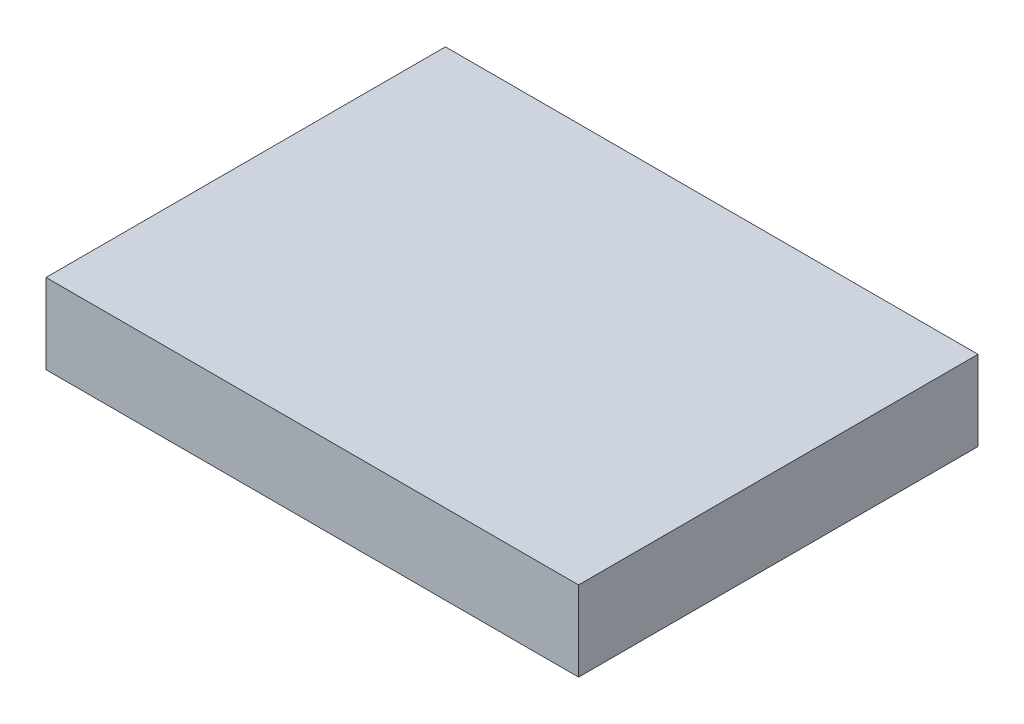
ISO-10303-21;
HEADER;
FILE_DESCRIPTION(('STEP AP214'),'2;1');
FILE_NAME('part.step','',(''),(''),'','','');
FILE_SCHEMA(('AUTOMOTIVE_DESIGN { 1 0 10303 214 1 1 1 1 }'));
ENDSEC;
DATA;
#1=APPLICATION_CONTEXT('core data for automotive mechanical design processes');
#2=APPLICATION_PROTOCOL_DEFINITION('international standard','automotive_design',2000,#1);
#3=PRODUCT_CONTEXT('',#1,'mechanical');
#4=PRODUCT('Part','Part','',(#3));
#5=PRODUCT_RELATED_PRODUCT_CATEGORY('part','',(#4));
#6=PRODUCT_DEFINITION_FORMATION('','',#4);
#7=PRODUCT_DEFINITION_CONTEXT('part definition',#1,'design');
#8=PRODUCT_DEFINITION('design','',#6,#7);
#9=PRODUCT_DEFINITION_SHAPE('','',#8);
#10=(LENGTH_UNIT() NAMED_UNIT(*) SI_UNIT(.MILLI.,.METRE.));
#11=(NAMED_UNIT(*) PLANE_ANGLE_UNIT() SI_UNIT($,.RADIAN.));
#12=(NAMED_UNIT(*) SI_UNIT($,.STERADIAN.) SOLID_ANGLE_UNIT());
#13=UNCERTAINTY_MEASURE_WITH_UNIT(LENGTH_MEASURE(1.E-05),#10,'distance_accuracy_value','');
#14=(GEOMETRIC_REPRESENTATION_CONTEXT(3) GLOBAL_UNCERTAINTY_ASSIGNED_CONTEXT((#13)) GLOBAL_UNIT_ASSIGNED_CONTEXT((#10,
#11,#12)) REPRESENTATION_CONTEXT('',''));
#15=CARTESIAN_POINT('',(0.,0.,0.));
#16=DIRECTION('',(0.,0.,1.));
#17=DIRECTION('',(1.,0.,0.));
#18=AXIS2_PLACEMENT_3D('',#15,#16,#17);
#19=CARTESIAN_POINT('',(-10.,3.,-7.5));
#20=DIRECTION('',(1.,0.,0.));
#21=DIRECTION('',(0.,0.,-1.));
#22=AXIS2_PLACEMENT_3D('',#19,#20,#21);
#23=PLANE('',#22);
#24=DIRECTION('',(0.,0.,1.));
#25=VECTOR('',#24,1.);
#26=CARTESIAN_POINT('',(-10.,0.,-7.5));
#27=LINE('',#26,#25);
#28=CARTESIAN_POINT('',(-10.,0.,-7.5));
#29=VERTEX_POINT('',#28);
#30=CARTESIAN_POINT('',(-9.99999999999999,0.,7.5));
#31=VERTEX_POINT('',#30);
#32=EDGE_CURVE('E105',#29,#31,#27,.T.);
#33=ORIENTED_EDGE('',*,*,#32,.T.);
#34=DIRECTION('',(0.,-1.,0.));
#35=VECTOR('',#34,1.);
#36=CARTESIAN_POINT('',(-9.99999999999999,3.,7.5));
#37=LINE('',#36,#35);
#38=CARTESIAN_POINT('',(-9.99999999999999,3.,7.5));
#39=VERTEX_POINT('',#38);
#40=EDGE_CURVE('E11',#39,#31,#37,.T.);
#41=ORIENTED_EDGE('',*,*,#40,.F.);
#42=DIRECTION('',(0.,0.,1.));
#43=VECTOR('',#42,1.);
#44=CARTESIAN_POINT('',(-10.,3.,-7.5));
#45=LINE('',#44,#43);
#46=CARTESIAN_POINT('',(-10.,3.,-7.5));
#47=VERTEX_POINT('',#46);
#48=EDGE_CURVE('E93',#47,#39,#45,.T.);
#49=ORIENTED_EDGE('',*,*,#48,.F.);
#50=DIRECTION('',(0.,-1.,0.));
#51=VECTOR('',#50,1.);
#52=CARTESIAN_POINT('',(-10.,3.,-7.5));
#53=LINE('',#52,#51);
#54=EDGE_CURVE('E101',#47,#29,#53,.T.);
#55=ORIENTED_EDGE('',*,*,#54,.T.);
#56=EDGE_LOOP('',(#33,#41,#49,#55));
#57=FACE_BOUND('',#56,.T.);
#58=ADVANCED_FACE('F42',(#57),#23,.F.);
#59=CARTESIAN_POINT('',(10.,3.,7.5));
#60=DIRECTION('',(0.,0.,-1.));
#61=DIRECTION('',(-1.,0.,0.));
#62=AXIS2_PLACEMENT_3D('',#59,#60,#61);
#63=PLANE('',#62);
#64=DIRECTION('',(1.,0.,0.));
#65=VECTOR('',#64,1.);
#66=CARTESIAN_POINT('',(10.,0.,7.5));
#67=LINE('',#66,#65);
#68=CARTESIAN_POINT('',(10.,0.,7.5));
#69=VERTEX_POINT('',#68);
#70=EDGE_CURVE('E97',#31,#69,#67,.T.);
#71=ORIENTED_EDGE('',*,*,#70,.T.);
#72=DIRECTION('',(0.,-1.,0.));
#73=VECTOR('',#72,1.);
#74=CARTESIAN_POINT('',(10.,3.,7.5));
#75=LINE('',#74,#73);
#76=CARTESIAN_POINT('',(10.,3.,7.5));
#77=VERTEX_POINT('',#76);
#78=EDGE_CURVE('E50',#77,#69,#75,.T.);
#79=ORIENTED_EDGE('',*,*,#78,.F.);
#80=DIRECTION('',(1.,0.,0.));
#81=VECTOR('',#80,1.);
#82=CARTESIAN_POINT('',(10.,3.,7.5));
#83=LINE('',#82,#81);
#84=EDGE_CURVE('E88',#39,#77,#83,.T.);
#85=ORIENTED_EDGE('',*,*,#84,.F.);
#86=ORIENTED_EDGE('',*,*,#40,.T.);
#87=EDGE_LOOP('',(#71,#79,#85,#86));
#88=FACE_BOUND('',#87,.T.);
#89=ADVANCED_FACE('F96',(#88),#63,.F.);
#90=CARTESIAN_POINT('',(10.,3.,-7.5));
#91=DIRECTION('',(-1.,0.,0.));
#92=DIRECTION('',(0.,0.,1.));
#93=AXIS2_PLACEMENT_3D('',#90,#91,#92);
#94=PLANE('',#93);
#95=DIRECTION('',(0.,0.,-1.));
#96=VECTOR('',#95,1.);
#97=CARTESIAN_POINT('',(10.,0.,-7.5));
#98=LINE('',#97,#96);
#99=CARTESIAN_POINT('',(10.,0.,-7.5));
#100=VERTEX_POINT('',#99);
#101=EDGE_CURVE('E75',#69,#100,#98,.T.);
#102=ORIENTED_EDGE('',*,*,#101,.T.);
#103=DIRECTION('',(0.,-1.,0.));
#104=VECTOR('',#103,1.);
#105=CARTESIAN_POINT('',(10.,3.,-7.5));
#106=LINE('',#105,#104);
#107=CARTESIAN_POINT('',(10.,3.,-7.5));
#108=VERTEX_POINT('',#107);
#109=EDGE_CURVE('E98',#108,#100,#106,.T.);
#110=ORIENTED_EDGE('',*,*,#109,.F.);
#111=DIRECTION('',(0.,0.,-1.));
#112=VECTOR('',#111,1.);
#113=CARTESIAN_POINT('',(10.,3.,-7.5));
#114=LINE('',#113,#112);
#115=EDGE_CURVE('E91',#77,#108,#114,.T.);
#116=ORIENTED_EDGE('',*,*,#115,.F.);
#117=ORIENTED_EDGE('',*,*,#78,.T.);
#118=EDGE_LOOP('',(#102,#110,#116,#117));
#119=FACE_BOUND('',#118,.T.);
#120=ADVANCED_FACE('F99',(#119),#94,.F.);
#121=CARTESIAN_POINT('',(10.,3.,-7.5));
#122=DIRECTION('',(0.,0.,1.));
#123=DIRECTION('',(1.,0.,0.));
#124=AXIS2_PLACEMENT_3D('',#121,#122,#123);
#125=PLANE('',#124);
#126=DIRECTION('',(-1.,0.,0.));
#127=VECTOR('',#126,1.);
#128=CARTESIAN_POINT('',(10.,0.,-7.5));
#129=LINE('',#128,#127);
#130=EDGE_CURVE('E81',#100,#29,#129,.T.);
#131=ORIENTED_EDGE('',*,*,#130,.T.);
#132=ORIENTED_EDGE('',*,*,#54,.F.);
#133=DIRECTION('',(-1.,0.,0.));
#134=VECTOR('',#133,1.);
#135=CARTESIAN_POINT('',(10.,3.,-7.5));
#136=LINE('',#135,#134);
#137=EDGE_CURVE('E58',#108,#47,#136,.T.);
#138=ORIENTED_EDGE('',*,*,#137,.F.);
#139=ORIENTED_EDGE('',*,*,#109,.T.);
#140=EDGE_LOOP('',(#131,#132,#138,#139));
#141=FACE_BOUND('',#140,.T.);
#142=ADVANCED_FACE('F112',(#141),#125,.F.);
#143=CARTESIAN_POINT('',(0.,3.,0.));
#144=DIRECTION('',(0.,-1.,0.));
#145=DIRECTION('',(0.,0.,-1.));
#146=AXIS2_PLACEMENT_3D('',#143,#144,#145);
#147=PLANE('',#146);
#148=ORIENTED_EDGE('',*,*,#48,.T.);
#149=ORIENTED_EDGE('',*,*,#84,.T.);
#150=ORIENTED_EDGE('',*,*,#115,.T.);
#151=ORIENTED_EDGE('',*,*,#137,.T.);
#152=EDGE_LOOP('',(#148,#149,#150,#151));
#153=FACE_BOUND('',#152,.T.);
#154=ADVANCED_FACE('F89',(#153),#147,.F.);
#155=CARTESIAN_POINT('',(0.,0.,0.));
#156=DIRECTION('',(0.,-1.,0.));
#157=DIRECTION('',(0.,0.,-1.));
#158=AXIS2_PLACEMENT_3D('',#155,#156,#157);
#159=PLANE('',#158);
#160=ORIENTED_EDGE('',*,*,#32,.F.);
#161=ORIENTED_EDGE('',*,*,#130,.F.);
#162=ORIENTED_EDGE('',*,*,#101,.F.);
#163=ORIENTED_EDGE('',*,*,#70,.F.);
#164=EDGE_LOOP('',(#160,#161,#162,#163));
#165=FACE_BOUND('',#164,.T.);
#166=ADVANCED_FACE('F115',(#165),#159,.T.);
#167=CLOSED_SHELL('',(#58,#89,#120,#142,#154,#166));
#168=MANIFOLD_SOLID_BREP('B2',#167);
#169=ADVANCED_BREP_SHAPE_REPRESENTATION('',(#18,#168),#14);
#170=SHAPE_DEFINITION_REPRESENTATION(#9,#169);
ENDSEC;
END-ISO-10303-21;
